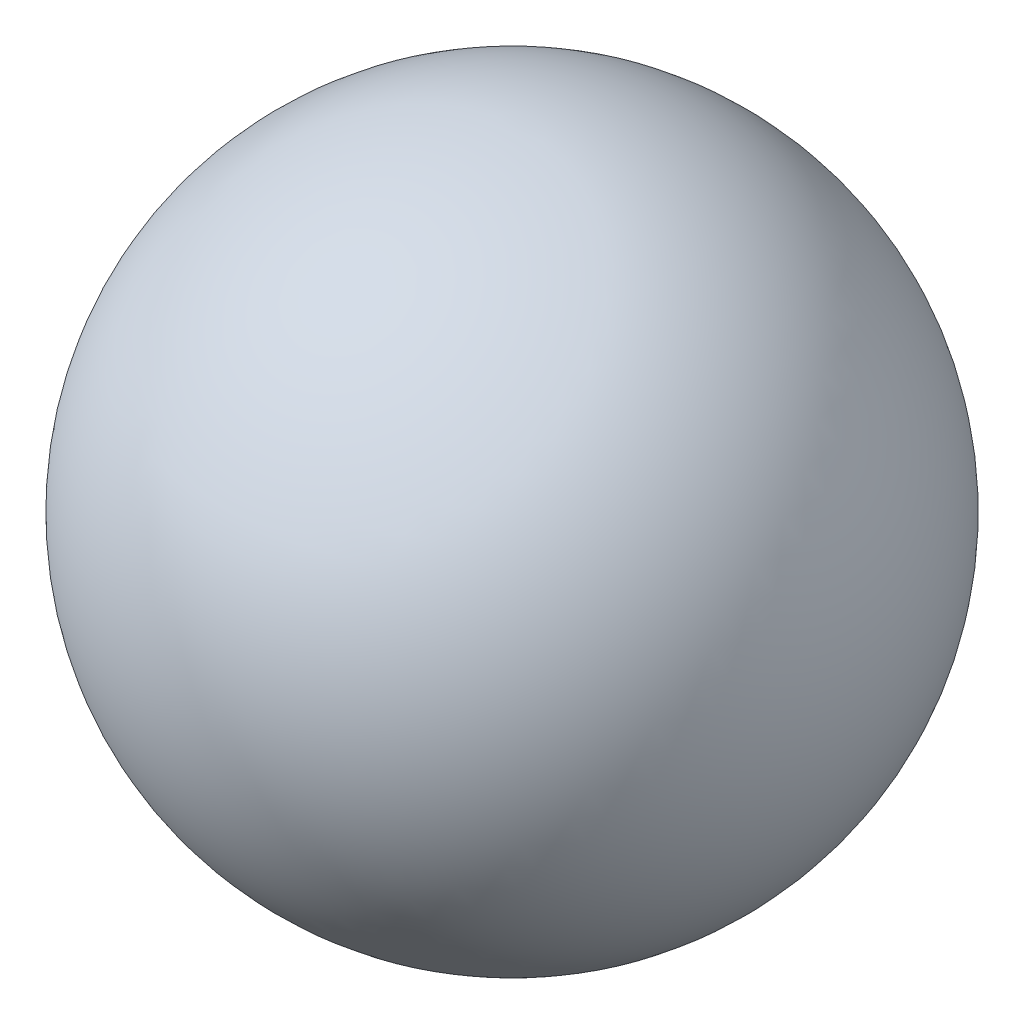
ISO-10303-21;
HEADER;
FILE_DESCRIPTION(('STEP AP214'),'2;1');
FILE_NAME('part.step','',(''),(''),'','','');
FILE_SCHEMA(('AUTOMOTIVE_DESIGN { 1 0 10303 214 1 1 1 1 }'));
ENDSEC;
DATA;
#1=APPLICATION_CONTEXT('core data for automotive mechanical design processes');
#2=APPLICATION_PROTOCOL_DEFINITION('international standard','automotive_design',2000,#1);
#3=PRODUCT_CONTEXT('',#1,'mechanical');
#4=PRODUCT('Part','Part','',(#3));
#5=PRODUCT_RELATED_PRODUCT_CATEGORY('part','',(#4));
#6=PRODUCT_DEFINITION_FORMATION('','',#4);
#7=PRODUCT_DEFINITION_CONTEXT('part definition',#1,'design');
#8=PRODUCT_DEFINITION('design','',#6,#7);
#9=PRODUCT_DEFINITION_SHAPE('','',#8);
#10=(LENGTH_UNIT() NAMED_UNIT(*) SI_UNIT(.MILLI.,.METRE.));
#11=(NAMED_UNIT(*) PLANE_ANGLE_UNIT() SI_UNIT($,.RADIAN.));
#12=(NAMED_UNIT(*) SI_UNIT($,.STERADIAN.) SOLID_ANGLE_UNIT());
#13=UNCERTAINTY_MEASURE_WITH_UNIT(LENGTH_MEASURE(1.E-05),#10,'distance_accuracy_value','');
#14=(GEOMETRIC_REPRESENTATION_CONTEXT(3) GLOBAL_UNCERTAINTY_ASSIGNED_CONTEXT((#13)) GLOBAL_UNIT_ASSIGNED_CONTEXT((#10,
#11,#12)) REPRESENTATION_CONTEXT('',''));
#15=CARTESIAN_POINT('',(0.,0.,0.));
#16=DIRECTION('',(0.,0.,1.));
#17=DIRECTION('',(1.,0.,0.));
#18=AXIS2_PLACEMENT_3D('',#15,#16,#17);
#19=CARTESIAN_POINT('',(0.,0.,0.));
#20=DIRECTION('',(0.,1.,0.));
#21=DIRECTION('',(1.,0.,0.));
#22=AXIS2_PLACEMENT_3D('',#19,#20,#21);
#23=SPHERICAL_SURFACE('',#22,33.5);
#24=CARTESIAN_POINT('',(0.,33.5,0.));
#25=VERTEX_POINT('',#24);
#26=VERTEX_LOOP('',#25);
#27=FACE_BOUND('',#26,.T.);
#28=ADVANCED_FACE('F34',(#27),#23,.T.);
#29=CLOSED_SHELL('',(#28));
#30=CARTESIAN_POINT('',(0.,0.,0.));
#31=DIRECTION('',(0.,1.,0.));
#32=DIRECTION('',(1.,0.,0.));
#33=AXIS2_PLACEMENT_3D('',#30,#31,#32);
#34=SPHERICAL_SURFACE('',#33,28.75);
#35=CARTESIAN_POINT('',(0.,28.75,0.));
#36=VERTEX_POINT('',#35);
#37=VERTEX_LOOP('',#36);
#38=FACE_BOUND('',#37,.T.);
#39=ADVANCED_FACE('F47',(#38),#34,.F.);
#40=CLOSED_SHELL('',(#39));
#41=ORIENTED_CLOSED_SHELL('',*,#40,.T.);
#42=BREP_WITH_VOIDS('B2',#29,(#41));
#43=ADVANCED_BREP_SHAPE_REPRESENTATION('',(#18,#42),#14);
#44=SHAPE_DEFINITION_REPRESENTATION(#9,#43);
ENDSEC;
END-ISO-10303-21;
